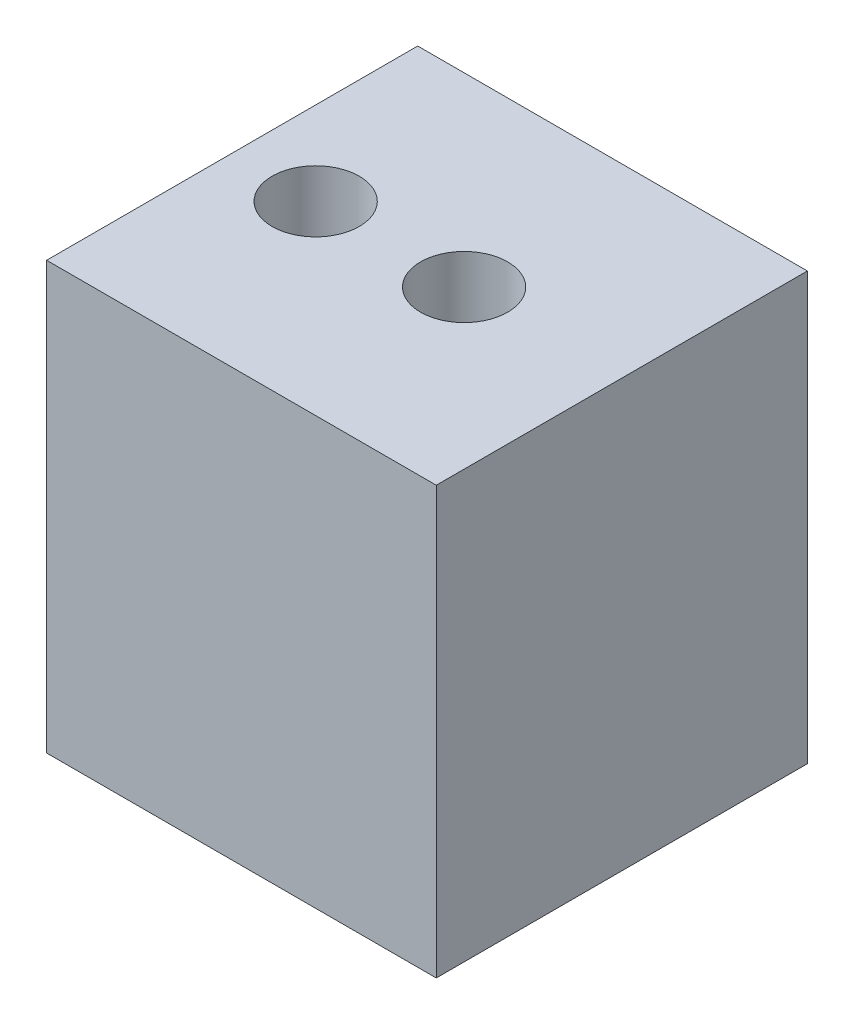
ISO-10303-21;
HEADER;
FILE_DESCRIPTION(('STEP AP214'),'2;1');
FILE_NAME('part.step','',(''),(''),'','','');
FILE_SCHEMA(('AUTOMOTIVE_DESIGN { 1 0 10303 214 1 1 1 1 }'));
ENDSEC;
DATA;
#1=APPLICATION_CONTEXT('core data for automotive mechanical design processes');
#2=APPLICATION_PROTOCOL_DEFINITION('international standard','automotive_design',2000,#1);
#3=PRODUCT_CONTEXT('',#1,'mechanical');
#4=PRODUCT('Part','Part','',(#3));
#5=PRODUCT_RELATED_PRODUCT_CATEGORY('part','',(#4));
#6=PRODUCT_DEFINITION_FORMATION('','',#4);
#7=PRODUCT_DEFINITION_CONTEXT('part definition',#1,'design');
#8=PRODUCT_DEFINITION('design','',#6,#7);
#9=PRODUCT_DEFINITION_SHAPE('','',#8);
#10=(LENGTH_UNIT() NAMED_UNIT(*) SI_UNIT(.MILLI.,.METRE.));
#11=(NAMED_UNIT(*) PLANE_ANGLE_UNIT() SI_UNIT($,.RADIAN.));
#12=(NAMED_UNIT(*) SI_UNIT($,.STERADIAN.) SOLID_ANGLE_UNIT());
#13=UNCERTAINTY_MEASURE_WITH_UNIT(LENGTH_MEASURE(1.E-05),#10,'distance_accuracy_value','');
#14=(GEOMETRIC_REPRESENTATION_CONTEXT(3) GLOBAL_UNCERTAINTY_ASSIGNED_CONTEXT((#13)) GLOBAL_UNIT_ASSIGNED_CONTEXT((#10,
#11,#12)) REPRESENTATION_CONTEXT('',''));
#15=CARTESIAN_POINT('',(0.,0.,0.));
#16=DIRECTION('',(0.,0.,1.));
#17=DIRECTION('',(1.,0.,0.));
#18=AXIS2_PLACEMENT_3D('',#15,#16,#17);
#19=CARTESIAN_POINT('',(0.,23.,0.));
#20=DIRECTION('',(0.,-1.,0.));
#21=DIRECTION('',(0.,0.,-1.));
#22=AXIS2_PLACEMENT_3D('',#19,#20,#21);
#23=PLANE('',#22);
#24=DIRECTION('',(0.,0.,-1.));
#25=VECTOR('',#24,1.);
#26=CARTESIAN_POINT('',(10.5,23.,10.));
#27=LINE('',#26,#25);
#28=CARTESIAN_POINT('',(10.5,23.,10.));
#29=VERTEX_POINT('',#28);
#30=CARTESIAN_POINT('',(10.5,23.,-10.));
#31=VERTEX_POINT('',#30);
#32=EDGE_CURVE('E89',#29,#31,#27,.T.);
#33=ORIENTED_EDGE('',*,*,#32,.T.);
#34=DIRECTION('',(-1.,0.,0.));
#35=VECTOR('',#34,1.);
#36=CARTESIAN_POINT('',(-10.5,23.,-10.));
#37=LINE('',#36,#35);
#38=CARTESIAN_POINT('',(-10.5,23.,-10.));
#39=VERTEX_POINT('',#38);
#40=EDGE_CURVE('E84',#31,#39,#37,.T.);
#41=ORIENTED_EDGE('',*,*,#40,.T.);
#42=DIRECTION('',(0.,0.,1.));
#43=VECTOR('',#42,1.);
#44=CARTESIAN_POINT('',(-10.5,23.,10.));
#45=LINE('',#44,#43);
#46=CARTESIAN_POINT('',(-10.5,23.,10.));
#47=VERTEX_POINT('',#46);
#48=EDGE_CURVE('E87',#39,#47,#45,.T.);
#49=ORIENTED_EDGE('',*,*,#48,.T.);
#50=DIRECTION('',(1.,0.,0.));
#51=VECTOR('',#50,1.);
#52=CARTESIAN_POINT('',(-10.5,23.,10.));
#53=LINE('',#52,#51);
#54=EDGE_CURVE('E54',#47,#29,#53,.T.);
#55=ORIENTED_EDGE('',*,*,#54,.T.);
#56=EDGE_LOOP('',(#33,#41,#49,#55));
#57=FACE_BOUND('',#56,.T.);
#58=CARTESIAN_POINT('',(-6.,23.,0.));
#59=DIRECTION('',(0.,1.,0.));
#60=DIRECTION('',(0.,0.,1.));
#61=AXIS2_PLACEMENT_3D('',#58,#59,#60);
#62=CIRCLE('',#61,2.35);
#63=CARTESIAN_POINT('',(-6.,23.,2.35));
#64=VERTEX_POINT('',#63);
#65=EDGE_CURVE('E104',#64,#64,#62,.T.);
#66=ORIENTED_EDGE('',*,*,#65,.F.);
#67=EDGE_LOOP('',(#66));
#68=FACE_BOUND('',#67,.T.);
#69=CARTESIAN_POINT('',(2.,23.,0.));
#70=DIRECTION('',(0.,1.,0.));
#71=DIRECTION('',(0.,0.,1.));
#72=AXIS2_PLACEMENT_3D('',#69,#70,#71);
#73=CIRCLE('',#72,2.35);
#74=CARTESIAN_POINT('',(2.,23.,2.35));
#75=VERTEX_POINT('',#74);
#76=EDGE_CURVE('E119',#75,#75,#73,.T.);
#77=ORIENTED_EDGE('',*,*,#76,.F.);
#78=EDGE_LOOP('',(#77));
#79=FACE_BOUND('',#78,.T.);
#80=ADVANCED_FACE('F37',(#57,#68,#79),#23,.F.);
#81=CARTESIAN_POINT('',(0.,0.,0.));
#82=DIRECTION('',(0.,-1.,0.));
#83=DIRECTION('',(0.,0.,-1.));
#84=AXIS2_PLACEMENT_3D('',#81,#82,#83);
#85=PLANE('',#84);
#86=CARTESIAN_POINT('',(-6.,0.,0.));
#87=DIRECTION('',(0.,1.,0.));
#88=DIRECTION('',(0.,0.,1.));
#89=AXIS2_PLACEMENT_3D('',#86,#87,#88);
#90=CIRCLE('',#89,2.35);
#91=CARTESIAN_POINT('',(-6.,0.,2.35));
#92=VERTEX_POINT('',#91);
#93=EDGE_CURVE('E116',#92,#92,#90,.T.);
#94=ORIENTED_EDGE('',*,*,#93,.T.);
#95=EDGE_LOOP('',(#94));
#96=FACE_BOUND('',#95,.T.);
#97=DIRECTION('',(0.,0.,-1.));
#98=VECTOR('',#97,1.);
#99=CARTESIAN_POINT('',(10.5,0.,10.));
#100=LINE('',#99,#98);
#101=CARTESIAN_POINT('',(10.5,0.,10.));
#102=VERTEX_POINT('',#101);
#103=CARTESIAN_POINT('',(10.5,0.,-10.));
#104=VERTEX_POINT('',#103);
#105=EDGE_CURVE('E101',#102,#104,#100,.T.);
#106=ORIENTED_EDGE('',*,*,#105,.F.);
#107=DIRECTION('',(1.,0.,0.));
#108=VECTOR('',#107,1.);
#109=CARTESIAN_POINT('',(-10.5,0.,10.));
#110=LINE('',#109,#108);
#111=CARTESIAN_POINT('',(-10.5,0.,10.));
#112=VERTEX_POINT('',#111);
#113=EDGE_CURVE('E77',#112,#102,#110,.T.);
#114=ORIENTED_EDGE('',*,*,#113,.F.);
#115=DIRECTION('',(0.,0.,1.));
#116=VECTOR('',#115,1.);
#117=CARTESIAN_POINT('',(-10.5,0.,10.));
#118=LINE('',#117,#116);
#119=CARTESIAN_POINT('',(-10.5,0.,-10.));
#120=VERTEX_POINT('',#119);
#121=EDGE_CURVE('E71',#120,#112,#118,.T.);
#122=ORIENTED_EDGE('',*,*,#121,.F.);
#123=DIRECTION('',(-1.,0.,0.));
#124=VECTOR('',#123,1.);
#125=CARTESIAN_POINT('',(-10.5,0.,-10.));
#126=LINE('',#125,#124);
#127=EDGE_CURVE('E93',#104,#120,#126,.T.);
#128=ORIENTED_EDGE('',*,*,#127,.F.);
#129=EDGE_LOOP('',(#106,#114,#122,#128));
#130=FACE_BOUND('',#129,.T.);
#131=CARTESIAN_POINT('',(2.,0.,0.));
#132=DIRECTION('',(0.,1.,0.));
#133=DIRECTION('',(0.,0.,1.));
#134=AXIS2_PLACEMENT_3D('',#131,#132,#133);
#135=CIRCLE('',#134,2.35);
#136=CARTESIAN_POINT('',(2.,0.,2.35));
#137=VERTEX_POINT('',#136);
#138=EDGE_CURVE('E122',#137,#137,#135,.T.);
#139=ORIENTED_EDGE('',*,*,#138,.T.);
#140=EDGE_LOOP('',(#139));
#141=FACE_BOUND('',#140,.T.);
#142=ADVANCED_FACE('F112',(#96,#130,#141),#85,.T.);
#143=CARTESIAN_POINT('',(10.5,23.,10.));
#144=DIRECTION('',(-1.,0.,0.));
#145=DIRECTION('',(0.,0.,1.));
#146=AXIS2_PLACEMENT_3D('',#143,#144,#145);
#147=PLANE('',#146);
#148=ORIENTED_EDGE('',*,*,#105,.T.);
#149=DIRECTION('',(0.,-1.,0.));
#150=VECTOR('',#149,1.);
#151=CARTESIAN_POINT('',(10.5,23.,-10.));
#152=LINE('',#151,#150);
#153=EDGE_CURVE('E11',#31,#104,#152,.T.);
#154=ORIENTED_EDGE('',*,*,#153,.F.);
#155=ORIENTED_EDGE('',*,*,#32,.F.);
#156=DIRECTION('',(0.,-1.,0.));
#157=VECTOR('',#156,1.);
#158=CARTESIAN_POINT('',(10.5,23.,10.));
#159=LINE('',#158,#157);
#160=EDGE_CURVE('E97',#29,#102,#159,.T.);
#161=ORIENTED_EDGE('',*,*,#160,.T.);
#162=EDGE_LOOP('',(#148,#154,#155,#161));
#163=FACE_BOUND('',#162,.T.);
#164=ADVANCED_FACE('F39',(#163),#147,.F.);
#165=CARTESIAN_POINT('',(-10.5,23.,-10.));
#166=DIRECTION('',(0.,0.,1.));
#167=DIRECTION('',(1.,0.,0.));
#168=AXIS2_PLACEMENT_3D('',#165,#166,#167);
#169=PLANE('',#168);
#170=ORIENTED_EDGE('',*,*,#127,.T.);
#171=DIRECTION('',(0.,-1.,0.));
#172=VECTOR('',#171,1.);
#173=CARTESIAN_POINT('',(-10.5,23.,-10.));
#174=LINE('',#173,#172);
#175=EDGE_CURVE('E46',#39,#120,#174,.T.);
#176=ORIENTED_EDGE('',*,*,#175,.F.);
#177=ORIENTED_EDGE('',*,*,#40,.F.);
#178=ORIENTED_EDGE('',*,*,#153,.T.);
#179=EDGE_LOOP('',(#170,#176,#177,#178));
#180=FACE_BOUND('',#179,.T.);
#181=ADVANCED_FACE('F92',(#180),#169,.F.);
#182=CARTESIAN_POINT('',(-10.5,23.,10.));
#183=DIRECTION('',(1.,0.,0.));
#184=DIRECTION('',(0.,0.,-1.));
#185=AXIS2_PLACEMENT_3D('',#182,#183,#184);
#186=PLANE('',#185);
#187=ORIENTED_EDGE('',*,*,#121,.T.);
#188=DIRECTION('',(0.,-1.,0.));
#189=VECTOR('',#188,1.);
#190=CARTESIAN_POINT('',(-10.5,23.,10.));
#191=LINE('',#190,#189);
#192=EDGE_CURVE('E94',#47,#112,#191,.T.);
#193=ORIENTED_EDGE('',*,*,#192,.F.);
#194=ORIENTED_EDGE('',*,*,#48,.F.);
#195=ORIENTED_EDGE('',*,*,#175,.T.);
#196=EDGE_LOOP('',(#187,#193,#194,#195));
#197=FACE_BOUND('',#196,.T.);
#198=ADVANCED_FACE('F95',(#197),#186,.F.);
#199=CARTESIAN_POINT('',(-10.5,23.,10.));
#200=DIRECTION('',(0.,0.,-1.));
#201=DIRECTION('',(-1.,0.,0.));
#202=AXIS2_PLACEMENT_3D('',#199,#200,#201);
#203=PLANE('',#202);
#204=ORIENTED_EDGE('',*,*,#113,.T.);
#205=ORIENTED_EDGE('',*,*,#160,.F.);
#206=ORIENTED_EDGE('',*,*,#54,.F.);
#207=ORIENTED_EDGE('',*,*,#192,.T.);
#208=EDGE_LOOP('',(#204,#205,#206,#207));
#209=FACE_BOUND('',#208,.T.);
#210=ADVANCED_FACE('F109',(#209),#203,.F.);
#211=CARTESIAN_POINT('',(-6.,23.,0.));
#212=DIRECTION('',(0.,-1.,0.));
#213=DIRECTION('',(0.,0.,-1.));
#214=AXIS2_PLACEMENT_3D('',#211,#212,#213);
#215=CYLINDRICAL_SURFACE('',#214,2.35);
#216=ORIENTED_EDGE('',*,*,#65,.T.);
#217=EDGE_LOOP('',(#216));
#218=FACE_BOUND('',#217,.T.);
#219=ORIENTED_EDGE('',*,*,#93,.F.);
#220=EDGE_LOOP('',(#219));
#221=FACE_BOUND('',#220,.T.);
#222=ADVANCED_FACE('F139',(#218,#221),#215,.F.);
#223=CARTESIAN_POINT('',(2.,23.,0.));
#224=DIRECTION('',(0.,-1.,0.));
#225=DIRECTION('',(0.,0.,-1.));
#226=AXIS2_PLACEMENT_3D('',#223,#224,#225);
#227=CYLINDRICAL_SURFACE('',#226,2.35);
#228=ORIENTED_EDGE('',*,*,#76,.T.);
#229=EDGE_LOOP('',(#228));
#230=FACE_BOUND('',#229,.T.);
#231=ORIENTED_EDGE('',*,*,#138,.F.);
#232=EDGE_LOOP('',(#231));
#233=FACE_BOUND('',#232,.T.);
#234=ADVANCED_FACE('F128',(#230,#233),#227,.F.);
#235=CLOSED_SHELL('',(#80,#142,#164,#181,#198,#210,#222,#234));
#236=MANIFOLD_SOLID_BREP('B2',#235);
#237=ADVANCED_BREP_SHAPE_REPRESENTATION('',(#18,#236),#14);
#238=SHAPE_DEFINITION_REPRESENTATION(#9,#237);
ENDSEC;
END-ISO-10303-21;
